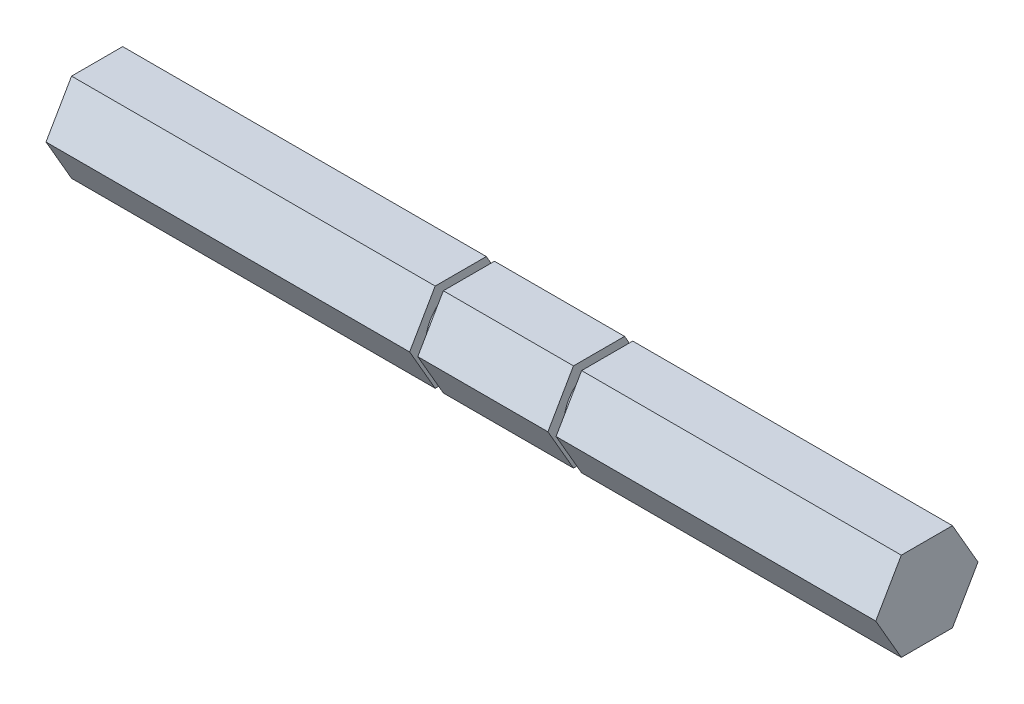
ISO-10303-21;
HEADER;
FILE_DESCRIPTION(('STEP AP214'),'2;1');
FILE_NAME('part.step','',(''),(''),'','','');
FILE_SCHEMA(('AUTOMOTIVE_DESIGN { 1 0 10303 214 1 1 1 1 }'));
ENDSEC;
DATA;
#1=APPLICATION_CONTEXT('core data for automotive mechanical design processes');
#2=APPLICATION_PROTOCOL_DEFINITION('international standard','automotive_design',2000,#1);
#3=PRODUCT_CONTEXT('',#1,'mechanical');
#4=PRODUCT('Part','Part','',(#3));
#5=PRODUCT_RELATED_PRODUCT_CATEGORY('part','',(#4));
#6=PRODUCT_DEFINITION_FORMATION('','',#4);
#7=PRODUCT_DEFINITION_CONTEXT('part definition',#1,'design');
#8=PRODUCT_DEFINITION('design','',#6,#7);
#9=PRODUCT_DEFINITION_SHAPE('','',#8);
#10=(LENGTH_UNIT() NAMED_UNIT(*) SI_UNIT(.MILLI.,.METRE.));
#11=(NAMED_UNIT(*) PLANE_ANGLE_UNIT() SI_UNIT($,.RADIAN.));
#12=(NAMED_UNIT(*) SI_UNIT($,.STERADIAN.) SOLID_ANGLE_UNIT());
#13=UNCERTAINTY_MEASURE_WITH_UNIT(LENGTH_MEASURE(1.E-05),#10,'distance_accuracy_value','');
#14=(GEOMETRIC_REPRESENTATION_CONTEXT(3) GLOBAL_UNCERTAINTY_ASSIGNED_CONTEXT((#13)) GLOBAL_UNIT_ASSIGNED_CONTEXT((#10,
#11,#12)) REPRESENTATION_CONTEXT('',''));
#15=CARTESIAN_POINT('',(0.,0.,0.));
#16=DIRECTION('',(0.,0.,1.));
#17=DIRECTION('',(1.,0.,0.));
#18=AXIS2_PLACEMENT_3D('',#15,#16,#17);
#19=CARTESIAN_POINT('',(59.5,-6.34999999999993,-3.66617420935418));
#20=DIRECTION('',(0.,0.499999999999995,0.866025403784442));
#21=DIRECTION('',(0.,-0.866025403784442,0.499999999999995));
#22=AXIS2_PLACEMENT_3D('',#19,#20,#21);
#23=PLANE('',#22);
#24=DIRECTION('',(0.,-0.866025403784442,0.499999999999995));
#25=VECTOR('',#24,1.);
#26=CARTESIAN_POINT('',(13.65,-6.34999999999993,-3.66617420935418));
#27=LINE('',#26,#25);
#28=CARTESIAN_POINT('',(13.65,0.,-7.33234841870822));
#29=VERTEX_POINT('',#28);
#30=CARTESIAN_POINT('',(13.65,-6.34999999999993,-3.66617420935418));
#31=VERTEX_POINT('',#30);
#32=EDGE_CURVE('E259',#29,#31,#27,.T.);
#33=ORIENTED_EDGE('',*,*,#32,.F.);
#34=DIRECTION('',(-1.,0.,0.));
#35=VECTOR('',#34,1.);
#36=CARTESIAN_POINT('',(59.5,0.,-7.33234841870822));
#37=LINE('',#36,#35);
#38=CARTESIAN_POINT('',(59.5,0.,-7.33234841870822));
#39=VERTEX_POINT('',#38);
#40=EDGE_CURVE('E164',#39,#29,#37,.T.);
#41=ORIENTED_EDGE('',*,*,#40,.F.);
#42=DIRECTION('',(0.,0.866025403784442,-0.499999999999995));
#43=VECTOR('',#42,1.);
#44=CARTESIAN_POINT('',(59.5,-6.34999999999993,-3.66617420935418));
#45=LINE('',#44,#43);
#46=CARTESIAN_POINT('',(59.5,-6.34999999999993,-3.66617420935418));
#47=VERTEX_POINT('',#46);
#48=EDGE_CURVE('E258',#47,#39,#45,.T.);
#49=ORIENTED_EDGE('',*,*,#48,.F.);
#50=DIRECTION('',(-1.,0.,0.));
#51=VECTOR('',#50,1.);
#52=CARTESIAN_POINT('',(59.5,-6.34999999999993,-3.66617420935418));
#53=LINE('',#52,#51);
#54=EDGE_CURVE('E183',#47,#31,#53,.T.);
#55=ORIENTED_EDGE('',*,*,#54,.T.);
#56=EDGE_LOOP('',(#33,#41,#49,#55));
#57=FACE_BOUND('',#56,.T.);
#58=ADVANCED_FACE('F34',(#57),#23,.F.);
#59=CARTESIAN_POINT('',(59.5,0.,-7.33234841870822));
#60=DIRECTION('',(0.,-0.500000000000001,0.866025403784438));
#61=DIRECTION('',(0.,-0.866025403784438,-0.500000000000001));
#62=AXIS2_PLACEMENT_3D('',#59,#60,#61);
#63=PLANE('',#62);
#64=DIRECTION('',(0.,-0.866025403784438,-0.500000000000001));
#65=VECTOR('',#64,1.);
#66=CARTESIAN_POINT('',(13.65,0.,-7.33234841870822));
#67=LINE('',#66,#65);
#68=CARTESIAN_POINT('',(13.65,6.34999999999999,-3.6661742093541));
#69=VERTEX_POINT('',#68);
#70=EDGE_CURVE('E255',#69,#29,#67,.T.);
#71=ORIENTED_EDGE('',*,*,#70,.F.);
#72=DIRECTION('',(-1.,0.,0.));
#73=VECTOR('',#72,1.);
#74=CARTESIAN_POINT('',(59.5,6.34999999999999,-3.6661742093541));
#75=LINE('',#74,#73);
#76=CARTESIAN_POINT('',(59.5,6.34999999999999,-3.6661742093541));
#77=VERTEX_POINT('',#76);
#78=EDGE_CURVE('E234',#77,#69,#75,.T.);
#79=ORIENTED_EDGE('',*,*,#78,.F.);
#80=DIRECTION('',(0.,0.866025403784438,0.500000000000001));
#81=VECTOR('',#80,1.);
#82=CARTESIAN_POINT('',(59.5,0.,-7.33234841870822));
#83=LINE('',#82,#81);
#84=EDGE_CURVE('E256',#39,#77,#83,.T.);
#85=ORIENTED_EDGE('',*,*,#84,.F.);
#86=ORIENTED_EDGE('',*,*,#40,.T.);
#87=EDGE_LOOP('',(#71,#79,#85,#86));
#88=FACE_BOUND('',#87,.T.);
#89=ADVANCED_FACE('F254',(#88),#63,.F.);
#90=CARTESIAN_POINT('',(59.5,6.34999999999999,-3.6661742093541));
#91=DIRECTION('',(0.,-1.,0.));
#92=DIRECTION('',(0.,0.,-1.));
#93=AXIS2_PLACEMENT_3D('',#90,#91,#92);
#94=PLANE('',#93);
#95=DIRECTION('',(0.,0.,-1.));
#96=VECTOR('',#95,1.);
#97=CARTESIAN_POINT('',(13.65,6.34999999999999,-3.6661742093541));
#98=LINE('',#97,#96);
#99=CARTESIAN_POINT('',(13.65,6.34999999999996,3.66617420935414));
#100=VERTEX_POINT('',#99);
#101=EDGE_CURVE('E264',#100,#69,#98,.T.);
#102=ORIENTED_EDGE('',*,*,#101,.F.);
#103=DIRECTION('',(-1.,0.,0.));
#104=VECTOR('',#103,1.);
#105=CARTESIAN_POINT('',(59.5,6.34999999999996,3.66617420935414));
#106=LINE('',#105,#104);
#107=CARTESIAN_POINT('',(59.5,6.34999999999996,3.66617420935414));
#108=VERTEX_POINT('',#107);
#109=EDGE_CURVE('E220',#108,#100,#106,.T.);
#110=ORIENTED_EDGE('',*,*,#109,.F.);
#111=DIRECTION('',(0.,0.,1.));
#112=VECTOR('',#111,1.);
#113=CARTESIAN_POINT('',(59.5,6.34999999999999,-3.6661742093541));
#114=LINE('',#113,#112);
#115=EDGE_CURVE('E278',#77,#108,#114,.T.);
#116=ORIENTED_EDGE('',*,*,#115,.F.);
#117=ORIENTED_EDGE('',*,*,#78,.T.);
#118=EDGE_LOOP('',(#102,#110,#116,#117));
#119=FACE_BOUND('',#118,.T.);
#120=ADVANCED_FACE('F317',(#119),#94,.F.);
#121=CARTESIAN_POINT('',(59.5,6.34999999999996,3.66617420935414));
#122=DIRECTION('',(0.,-0.499999999999995,-0.866025403784442));
#123=DIRECTION('',(0.,0.866025403784442,-0.499999999999995));
#124=AXIS2_PLACEMENT_3D('',#121,#122,#123);
#125=PLANE('',#124);
#126=DIRECTION('',(0.,0.866025403784442,-0.499999999999995));
#127=VECTOR('',#126,1.);
#128=CARTESIAN_POINT('',(13.65,6.34999999999996,3.66617420935414));
#129=LINE('',#128,#127);
#130=CARTESIAN_POINT('',(13.65,0.,7.33234841870822));
#131=VERTEX_POINT('',#130);
#132=EDGE_CURVE('E315',#131,#100,#129,.T.);
#133=ORIENTED_EDGE('',*,*,#132,.F.);
#134=DIRECTION('',(-1.,0.,0.));
#135=VECTOR('',#134,1.);
#136=CARTESIAN_POINT('',(59.5,0.,7.33234841870822));
#137=LINE('',#136,#135);
#138=CARTESIAN_POINT('',(59.5,0.,7.33234841870822));
#139=VERTEX_POINT('',#138);
#140=EDGE_CURVE('E207',#139,#131,#137,.T.);
#141=ORIENTED_EDGE('',*,*,#140,.F.);
#142=DIRECTION('',(0.,-0.866025403784441,0.499999999999995));
#143=VECTOR('',#142,1.);
#144=CARTESIAN_POINT('',(59.5,6.34999999999996,3.66617420935414));
#145=LINE('',#144,#143);
#146=EDGE_CURVE('E280',#108,#139,#145,.T.);
#147=ORIENTED_EDGE('',*,*,#146,.F.);
#148=ORIENTED_EDGE('',*,*,#109,.T.);
#149=EDGE_LOOP('',(#133,#141,#147,#148));
#150=FACE_BOUND('',#149,.T.);
#151=ADVANCED_FACE('F318',(#150),#125,.F.);
#152=CARTESIAN_POINT('',(59.5,0.,7.33234841870822));
#153=DIRECTION('',(0.,0.500000000000007,-0.866025403784435));
#154=DIRECTION('',(0.,0.866025403784435,0.500000000000007));
#155=AXIS2_PLACEMENT_3D('',#152,#153,#154);
#156=PLANE('',#155);
#157=DIRECTION('',(0.,0.866025403784435,0.500000000000007));
#158=VECTOR('',#157,1.);
#159=CARTESIAN_POINT('',(13.65,0.,7.33234841870822));
#160=LINE('',#159,#158);
#161=CARTESIAN_POINT('',(13.65,-6.35000000000001,3.66617420935405));
#162=VERTEX_POINT('',#161);
#163=EDGE_CURVE('E313',#162,#131,#160,.T.);
#164=ORIENTED_EDGE('',*,*,#163,.F.);
#165=DIRECTION('',(-1.,0.,0.));
#166=VECTOR('',#165,1.);
#167=CARTESIAN_POINT('',(59.5,-6.35000000000001,3.66617420935405));
#168=LINE('',#167,#166);
#169=CARTESIAN_POINT('',(59.5,-6.35000000000001,3.66617420935405));
#170=VERTEX_POINT('',#169);
#171=EDGE_CURVE('E196',#170,#162,#168,.T.);
#172=ORIENTED_EDGE('',*,*,#171,.F.);
#173=DIRECTION('',(0.,-0.866025403784435,-0.500000000000007));
#174=VECTOR('',#173,1.);
#175=CARTESIAN_POINT('',(59.5,0.,7.33234841870822));
#176=LINE('',#175,#174);
#177=EDGE_CURVE('E185',#139,#170,#176,.T.);
#178=ORIENTED_EDGE('',*,*,#177,.F.);
#179=ORIENTED_EDGE('',*,*,#140,.T.);
#180=EDGE_LOOP('',(#164,#172,#178,#179));
#181=FACE_BOUND('',#180,.T.);
#182=ADVANCED_FACE('F363',(#181),#156,.F.);
#183=CARTESIAN_POINT('',(59.5,-6.35000000000001,3.66617420935405));
#184=DIRECTION('',(0.,1.,0.));
#185=DIRECTION('',(0.,0.,1.));
#186=AXIS2_PLACEMENT_3D('',#183,#184,#185);
#187=PLANE('',#186);
#188=DIRECTION('',(0.,0.,1.));
#189=VECTOR('',#188,1.);
#190=CARTESIAN_POINT('',(13.65,-6.35000000000001,3.66617420935405));
#191=LINE('',#190,#189);
#192=EDGE_CURVE('E42',#31,#162,#191,.T.);
#193=ORIENTED_EDGE('',*,*,#192,.F.);
#194=ORIENTED_EDGE('',*,*,#54,.F.);
#195=DIRECTION('',(0.,0.,-1.));
#196=VECTOR('',#195,1.);
#197=CARTESIAN_POINT('',(59.5,-6.35000000000001,3.66617420935405));
#198=LINE('',#197,#196);
#199=EDGE_CURVE('E181',#170,#47,#198,.T.);
#200=ORIENTED_EDGE('',*,*,#199,.F.);
#201=ORIENTED_EDGE('',*,*,#171,.T.);
#202=EDGE_LOOP('',(#193,#194,#200,#201));
#203=FACE_BOUND('',#202,.T.);
#204=ADVANCED_FACE('F321',(#203),#187,.F.);
#205=CARTESIAN_POINT('',(59.5,0.,0.));
#206=DIRECTION('',(1.,0.,0.));
#207=DIRECTION('',(0.,0.,-1.));
#208=AXIS2_PLACEMENT_3D('',#205,#206,#207);
#209=PLANE('',#208);
#210=ORIENTED_EDGE('',*,*,#48,.T.);
#211=ORIENTED_EDGE('',*,*,#84,.T.);
#212=ORIENTED_EDGE('',*,*,#115,.T.);
#213=ORIENTED_EDGE('',*,*,#146,.T.);
#214=ORIENTED_EDGE('',*,*,#177,.T.);
#215=ORIENTED_EDGE('',*,*,#199,.T.);
#216=EDGE_LOOP('',(#210,#211,#212,#213,#214,#215));
#217=FACE_BOUND('',#216,.T.);
#218=ADVANCED_FACE('F320',(#217),#209,.T.);
#219=CARTESIAN_POINT('',(12.4816,13.9685232179915,0.));
#220=DIRECTION('',(1.,0.,0.));
#221=DIRECTION('',(0.,0.,-1.));
#222=AXIS2_PLACEMENT_3D('',#219,#220,#221);
#223=PLANE('',#222);
#224=CARTESIAN_POINT('',(12.4816,0.,0.));
#225=DIRECTION('',(-1.,0.,0.));
#226=DIRECTION('',(0.,0.,1.));
#227=AXIS2_PLACEMENT_3D('',#224,#225,#226);
#228=CIRCLE('',#227,5.0292);
#229=CARTESIAN_POINT('',(12.4816,0.,5.0292));
#230=VERTEX_POINT('',#229);
#231=EDGE_CURVE('E563',#230,#230,#228,.T.);
#232=ORIENTED_EDGE('',*,*,#231,.T.);
#233=EDGE_LOOP('',(#232));
#234=FACE_BOUND('',#233,.T.);
#235=DIRECTION('',(0.,0.866025403784442,-0.499999999999995));
#236=VECTOR('',#235,1.);
#237=CARTESIAN_POINT('',(12.4816,-6.34999999999993,-3.66617420935418));
#238=LINE('',#237,#236);
#239=CARTESIAN_POINT('',(12.4816,-6.34999999999993,-3.66617420935418));
#240=VERTEX_POINT('',#239);
#241=CARTESIAN_POINT('',(12.4816,0.,-7.33234841870822));
#242=VERTEX_POINT('',#241);
#243=EDGE_CURVE('E273',#240,#242,#238,.T.);
#244=ORIENTED_EDGE('',*,*,#243,.T.);
#245=DIRECTION('',(0.,0.866025403784438,0.500000000000001));
#246=VECTOR('',#245,1.);
#247=CARTESIAN_POINT('',(12.4816,0.,-7.33234841870822));
#248=LINE('',#247,#246);
#249=CARTESIAN_POINT('',(12.4816,6.34999999999999,-3.6661742093541));
#250=VERTEX_POINT('',#249);
#251=EDGE_CURVE('E271',#242,#250,#248,.T.);
#252=ORIENTED_EDGE('',*,*,#251,.T.);
#253=DIRECTION('',(0.,0.,1.));
#254=VECTOR('',#253,1.);
#255=CARTESIAN_POINT('',(12.4816,6.34999999999999,-3.6661742093541));
#256=LINE('',#255,#254);
#257=CARTESIAN_POINT('',(12.4816,6.34999999999996,3.66617420935414));
#258=VERTEX_POINT('',#257);
#259=EDGE_CURVE('E269',#250,#258,#256,.T.);
#260=ORIENTED_EDGE('',*,*,#259,.T.);
#261=DIRECTION('',(0.,-0.866025403784442,0.499999999999995));
#262=VECTOR('',#261,1.);
#263=CARTESIAN_POINT('',(12.4816,6.34999999999996,3.66617420935414));
#264=LINE('',#263,#262);
#265=CARTESIAN_POINT('',(12.4816,0.,7.33234841870822));
#266=VERTEX_POINT('',#265);
#267=EDGE_CURVE('E262',#258,#266,#264,.T.);
#268=ORIENTED_EDGE('',*,*,#267,.T.);
#269=DIRECTION('',(0.,-0.866025403784435,-0.500000000000007));
#270=VECTOR('',#269,1.);
#271=CARTESIAN_POINT('',(12.4816,0.,7.33234841870822));
#272=LINE('',#271,#270);
#273=CARTESIAN_POINT('',(12.4816,-6.35000000000001,3.66617420935405));
#274=VERTEX_POINT('',#273);
#275=EDGE_CURVE('E56',#266,#274,#272,.T.);
#276=ORIENTED_EDGE('',*,*,#275,.T.);
#277=DIRECTION('',(0.,0.,-1.));
#278=VECTOR('',#277,1.);
#279=CARTESIAN_POINT('',(12.4816,-6.35000000000001,3.66617420935405));
#280=LINE('',#279,#278);
#281=EDGE_CURVE('E11',#274,#240,#280,.T.);
#282=ORIENTED_EDGE('',*,*,#281,.T.);
#283=EDGE_LOOP('',(#244,#252,#260,#268,#276,#282));
#284=FACE_BOUND('',#283,.T.);
#285=ADVANCED_FACE('F337',(#234,#284),#223,.T.);
#286=CARTESIAN_POINT('',(13.65,13.9685232179915,0.));
#287=DIRECTION('',(-1.,0.,0.));
#288=DIRECTION('',(0.,0.,1.));
#289=AXIS2_PLACEMENT_3D('',#286,#287,#288);
#290=PLANE('',#289);
#291=CARTESIAN_POINT('',(13.65,0.,0.));
#292=DIRECTION('',(-1.,0.,0.));
#293=DIRECTION('',(0.,0.,1.));
#294=AXIS2_PLACEMENT_3D('',#291,#292,#293);
#295=CIRCLE('',#294,5.0292);
#296=CARTESIAN_POINT('',(13.65,0.,5.0292));
#297=VERTEX_POINT('',#296);
#298=EDGE_CURVE('E560',#297,#297,#295,.T.);
#299=ORIENTED_EDGE('',*,*,#298,.F.);
#300=EDGE_LOOP('',(#299));
#301=FACE_BOUND('',#300,.T.);
#302=ORIENTED_EDGE('',*,*,#32,.T.);
#303=ORIENTED_EDGE('',*,*,#192,.T.);
#304=ORIENTED_EDGE('',*,*,#163,.T.);
#305=ORIENTED_EDGE('',*,*,#132,.T.);
#306=ORIENTED_EDGE('',*,*,#101,.T.);
#307=ORIENTED_EDGE('',*,*,#70,.T.);
#308=EDGE_LOOP('',(#302,#303,#304,#305,#306,#307));
#309=FACE_BOUND('',#308,.T.);
#310=ADVANCED_FACE('F316',(#301,#309),#290,.T.);
#311=CARTESIAN_POINT('',(0.,0.,0.));
#312=DIRECTION('',(-1.,0.,0.));
#313=DIRECTION('',(0.,0.,1.));
#314=AXIS2_PLACEMENT_3D('',#311,#312,#313);
#315=CYLINDRICAL_SURFACE('',#314,5.0292);
#316=ORIENTED_EDGE('',*,*,#298,.T.);
#317=EDGE_LOOP('',(#316));
#318=FACE_BOUND('',#317,.T.);
#319=ORIENTED_EDGE('',*,*,#231,.F.);
#320=EDGE_LOOP('',(#319));
#321=FACE_BOUND('',#320,.T.);
#322=ADVANCED_FACE('F426',(#318,#321),#315,.T.);
#323=ORIENTED_EDGE('',*,*,#281,.F.);
#324=CARTESIAN_POINT('',(-6.18160000000001,-6.35000000000001,3.66617420935405));
#325=VERTEX_POINT('',#324);
#326=EDGE_CURVE('E195',#274,#325,#168,.T.);
#327=ORIENTED_EDGE('',*,*,#326,.T.);
#328=DIRECTION('',(0.,0.,1.));
#329=VECTOR('',#328,1.);
#330=CARTESIAN_POINT('',(-6.18160000000001,-6.35000000000001,3.66617420935405));
#331=LINE('',#330,#329);
#332=CARTESIAN_POINT('',(-6.18160000000001,-6.34999999999993,-3.66617420935418));
#333=VERTEX_POINT('',#332);
#334=EDGE_CURVE('E163',#333,#325,#331,.T.);
#335=ORIENTED_EDGE('',*,*,#334,.F.);
#336=EDGE_CURVE('E180',#240,#333,#53,.T.);
#337=ORIENTED_EDGE('',*,*,#336,.F.);
#338=EDGE_LOOP('',(#323,#327,#335,#337));
#339=FACE_BOUND('',#338,.T.);
#340=ADVANCED_FACE('F335',(#339),#187,.F.);
#341=ORIENTED_EDGE('',*,*,#275,.F.);
#342=CARTESIAN_POINT('',(-6.18160000000001,0.,7.33234841870822));
#343=VERTEX_POINT('',#342);
#344=EDGE_CURVE('E206',#266,#343,#137,.T.);
#345=ORIENTED_EDGE('',*,*,#344,.T.);
#346=DIRECTION('',(0.,0.866025403784435,0.500000000000007));
#347=VECTOR('',#346,1.);
#348=CARTESIAN_POINT('',(-6.18160000000001,0.,7.33234841870822));
#349=LINE('',#348,#347);
#350=EDGE_CURVE('E173',#325,#343,#349,.T.);
#351=ORIENTED_EDGE('',*,*,#350,.F.);
#352=ORIENTED_EDGE('',*,*,#326,.F.);
#353=EDGE_LOOP('',(#341,#345,#351,#352));
#354=FACE_BOUND('',#353,.T.);
#355=ADVANCED_FACE('F333',(#354),#156,.F.);
#356=ORIENTED_EDGE('',*,*,#267,.F.);
#357=CARTESIAN_POINT('',(-6.18160000000001,6.34999999999996,3.66617420935414));
#358=VERTEX_POINT('',#357);
#359=EDGE_CURVE('E219',#258,#358,#106,.T.);
#360=ORIENTED_EDGE('',*,*,#359,.T.);
#361=DIRECTION('',(0.,0.866025403784442,-0.499999999999995));
#362=VECTOR('',#361,1.);
#363=CARTESIAN_POINT('',(-6.18160000000001,6.34999999999996,3.66617420935414));
#364=LINE('',#363,#362);
#365=EDGE_CURVE('E305',#343,#358,#364,.T.);
#366=ORIENTED_EDGE('',*,*,#365,.F.);
#367=ORIENTED_EDGE('',*,*,#344,.F.);
#368=EDGE_LOOP('',(#356,#360,#366,#367));
#369=FACE_BOUND('',#368,.T.);
#370=ADVANCED_FACE('F352',(#369),#125,.F.);
#371=ORIENTED_EDGE('',*,*,#259,.F.);
#372=CARTESIAN_POINT('',(-6.18160000000001,6.34999999999999,-3.6661742093541));
#373=VERTEX_POINT('',#372);
#374=EDGE_CURVE('E233',#250,#373,#75,.T.);
#375=ORIENTED_EDGE('',*,*,#374,.T.);
#376=DIRECTION('',(0.,0.,-1.));
#377=VECTOR('',#376,1.);
#378=CARTESIAN_POINT('',(-6.18160000000001,6.34999999999999,-3.6661742093541));
#379=LINE('',#378,#377);
#380=EDGE_CURVE('E307',#358,#373,#379,.T.);
#381=ORIENTED_EDGE('',*,*,#380,.F.);
#382=ORIENTED_EDGE('',*,*,#359,.F.);
#383=EDGE_LOOP('',(#371,#375,#381,#382));
#384=FACE_BOUND('',#383,.T.);
#385=ADVANCED_FACE('F349',(#384),#94,.F.);
#386=ORIENTED_EDGE('',*,*,#251,.F.);
#387=CARTESIAN_POINT('',(-6.18160000000001,0.,-7.33234841870822));
#388=VERTEX_POINT('',#387);
#389=EDGE_CURVE('E246',#242,#388,#37,.T.);
#390=ORIENTED_EDGE('',*,*,#389,.T.);
#391=DIRECTION('',(0.,-0.866025403784438,-0.500000000000001));
#392=VECTOR('',#391,1.);
#393=CARTESIAN_POINT('',(-6.18160000000001,0.,-7.33234841870822));
#394=LINE('',#393,#392);
#395=EDGE_CURVE('E309',#373,#388,#394,.T.);
#396=ORIENTED_EDGE('',*,*,#395,.F.);
#397=ORIENTED_EDGE('',*,*,#374,.F.);
#398=EDGE_LOOP('',(#386,#390,#396,#397));
#399=FACE_BOUND('',#398,.T.);
#400=ADVANCED_FACE('F343',(#399),#63,.F.);
#401=ORIENTED_EDGE('',*,*,#243,.F.);
#402=ORIENTED_EDGE('',*,*,#336,.T.);
#403=DIRECTION('',(0.,-0.866025403784442,0.499999999999995));
#404=VECTOR('',#403,1.);
#405=CARTESIAN_POINT('',(-6.18160000000001,-6.34999999999993,-3.66617420935418));
#406=LINE('',#405,#404);
#407=EDGE_CURVE('E311',#388,#333,#406,.T.);
#408=ORIENTED_EDGE('',*,*,#407,.F.);
#409=ORIENTED_EDGE('',*,*,#389,.F.);
#410=EDGE_LOOP('',(#401,#402,#408,#409));
#411=FACE_BOUND('',#410,.T.);
#412=ADVANCED_FACE('F36',(#411),#23,.F.);
#413=CARTESIAN_POINT('',(-6.1816,13.9685232179914,0.));
#414=DIRECTION('',(-1.,0.,0.));
#415=DIRECTION('',(0.,0.,1.));
#416=AXIS2_PLACEMENT_3D('',#413,#414,#415);
#417=PLANE('',#416);
#418=CARTESIAN_POINT('',(-6.1816,0.,0.));
#419=DIRECTION('',(-1.,0.,0.));
#420=DIRECTION('',(0.,0.,1.));
#421=AXIS2_PLACEMENT_3D('',#418,#419,#420);
#422=CIRCLE('',#421,5.02919999999986);
#423=CARTESIAN_POINT('',(-6.1816,0.,5.02919999999986));
#424=VERTEX_POINT('',#423);
#425=EDGE_CURVE('E555',#424,#424,#422,.T.);
#426=ORIENTED_EDGE('',*,*,#425,.F.);
#427=EDGE_LOOP('',(#426));
#428=FACE_BOUND('',#427,.T.);
#429=ORIENTED_EDGE('',*,*,#407,.T.);
#430=ORIENTED_EDGE('',*,*,#334,.T.);
#431=ORIENTED_EDGE('',*,*,#350,.T.);
#432=ORIENTED_EDGE('',*,*,#365,.T.);
#433=ORIENTED_EDGE('',*,*,#380,.T.);
#434=ORIENTED_EDGE('',*,*,#395,.T.);
#435=EDGE_LOOP('',(#429,#430,#431,#432,#433,#434));
#436=FACE_BOUND('',#435,.T.);
#437=ADVANCED_FACE('F326',(#428,#436),#417,.T.);
#438=CARTESIAN_POINT('',(-7.35,13.9685232179914,0.));
#439=DIRECTION('',(1.,0.,0.));
#440=DIRECTION('',(0.,0.,-1.));
#441=AXIS2_PLACEMENT_3D('',#438,#439,#440);
#442=PLANE('',#441);
#443=CARTESIAN_POINT('',(-7.35,0.,0.));
#444=DIRECTION('',(-1.,0.,0.));
#445=DIRECTION('',(0.,0.,1.));
#446=AXIS2_PLACEMENT_3D('',#443,#444,#445);
#447=CIRCLE('',#446,5.02919999999986);
#448=CARTESIAN_POINT('',(-7.35,0.,5.02919999999986));
#449=VERTEX_POINT('',#448);
#450=EDGE_CURVE('E558',#449,#449,#447,.T.);
#451=ORIENTED_EDGE('',*,*,#450,.T.);
#452=EDGE_LOOP('',(#451));
#453=FACE_BOUND('',#452,.T.);
#454=DIRECTION('',(0.,0.866025403784442,-0.499999999999995));
#455=VECTOR('',#454,1.);
#456=CARTESIAN_POINT('',(-7.35000000000001,-6.34999999999993,-3.66617420935418));
#457=LINE('',#456,#455);
#458=CARTESIAN_POINT('',(-7.35000000000001,-6.34999999999993,-3.66617420935418));
#459=VERTEX_POINT('',#458);
#460=CARTESIAN_POINT('',(-7.35000000000001,0.,-7.33234841870822));
#461=VERTEX_POINT('',#460);
#462=EDGE_CURVE('E158',#459,#461,#457,.T.);
#463=ORIENTED_EDGE('',*,*,#462,.T.);
#464=DIRECTION('',(0.,0.866025403784438,0.500000000000001));
#465=VECTOR('',#464,1.);
#466=CARTESIAN_POINT('',(-7.35000000000001,0.,-7.33234841870822));
#467=LINE('',#466,#465);
#468=CARTESIAN_POINT('',(-7.35000000000001,6.34999999999999,-3.6661742093541));
#469=VERTEX_POINT('',#468);
#470=EDGE_CURVE('E174',#461,#469,#467,.T.);
#471=ORIENTED_EDGE('',*,*,#470,.T.);
#472=DIRECTION('',(0.,0.,1.));
#473=VECTOR('',#472,1.);
#474=CARTESIAN_POINT('',(-7.35000000000001,6.34999999999999,-3.6661742093541));
#475=LINE('',#474,#473);
#476=CARTESIAN_POINT('',(-7.35000000000001,6.34999999999996,3.66617420935414));
#477=VERTEX_POINT('',#476);
#478=EDGE_CURVE('E298',#469,#477,#475,.T.);
#479=ORIENTED_EDGE('',*,*,#478,.T.);
#480=DIRECTION('',(0.,-0.866025403784442,0.499999999999995));
#481=VECTOR('',#480,1.);
#482=CARTESIAN_POINT('',(-7.35000000000001,6.34999999999996,3.66617420935414));
#483=LINE('',#482,#481);
#484=CARTESIAN_POINT('',(-7.35000000000001,0.,7.33234841870822));
#485=VERTEX_POINT('',#484);
#486=EDGE_CURVE('E300',#477,#485,#483,.T.);
#487=ORIENTED_EDGE('',*,*,#486,.T.);
#488=DIRECTION('',(0.,-0.866025403784435,-0.500000000000007));
#489=VECTOR('',#488,1.);
#490=CARTESIAN_POINT('',(-7.35000000000001,0.,7.33234841870822));
#491=LINE('',#490,#489);
#492=CARTESIAN_POINT('',(-7.35000000000001,-6.35000000000001,3.66617420935405));
#493=VERTEX_POINT('',#492);
#494=EDGE_CURVE('E49',#485,#493,#491,.T.);
#495=ORIENTED_EDGE('',*,*,#494,.T.);
#496=DIRECTION('',(0.,0.,-1.));
#497=VECTOR('',#496,1.);
#498=CARTESIAN_POINT('',(-7.35000000000001,-6.35000000000001,3.66617420935405));
#499=LINE('',#498,#497);
#500=EDGE_CURVE('E155',#493,#459,#499,.T.);
#501=ORIENTED_EDGE('',*,*,#500,.T.);
#502=EDGE_LOOP('',(#463,#471,#479,#487,#495,#501));
#503=FACE_BOUND('',#502,.T.);
#504=ADVANCED_FACE('F157',(#453,#503),#442,.T.);
#505=CARTESIAN_POINT('',(0.,0.,0.));
#506=DIRECTION('',(-1.,0.,0.));
#507=DIRECTION('',(0.,0.,1.));
#508=AXIS2_PLACEMENT_3D('',#505,#506,#507);
#509=CYLINDRICAL_SURFACE('',#508,5.02919999999986);
#510=ORIENTED_EDGE('',*,*,#425,.T.);
#511=EDGE_LOOP('',(#510));
#512=FACE_BOUND('',#511,.T.);
#513=ORIENTED_EDGE('',*,*,#450,.F.);
#514=EDGE_LOOP('',(#513));
#515=FACE_BOUND('',#514,.T.);
#516=ADVANCED_FACE('F483',(#512,#515),#509,.T.);
#517=CARTESIAN_POINT('',(-59.5,0.,0.));
#518=DIRECTION('',(1.,0.,0.));
#519=DIRECTION('',(0.,0.,-1.));
#520=AXIS2_PLACEMENT_3D('',#517,#518,#519);
#521=PLANE('',#520);
#522=DIRECTION('',(0.,0.866025403784442,-0.499999999999995));
#523=VECTOR('',#522,1.);
#524=CARTESIAN_POINT('',(-59.5,-6.34999999999993,-3.66617420935418));
#525=LINE('',#524,#523);
#526=CARTESIAN_POINT('',(-59.5,-6.34999999999993,-3.66617420935418));
#527=VERTEX_POINT('',#526);
#528=CARTESIAN_POINT('',(-59.5,0.,-7.33234841870822));
#529=VERTEX_POINT('',#528);
#530=EDGE_CURVE('E275',#527,#529,#525,.T.);
#531=ORIENTED_EDGE('',*,*,#530,.F.);
#532=DIRECTION('',(0.,0.,-1.));
#533=VECTOR('',#532,1.);
#534=CARTESIAN_POINT('',(-59.5,-6.35000000000001,3.66617420935405));
#535=LINE('',#534,#533);
#536=CARTESIAN_POINT('',(-59.5,-6.35000000000001,3.66617420935405));
#537=VERTEX_POINT('',#536);
#538=EDGE_CURVE('E178',#537,#527,#535,.T.);
#539=ORIENTED_EDGE('',*,*,#538,.F.);
#540=DIRECTION('',(0.,-0.866025403784435,-0.500000000000007));
#541=VECTOR('',#540,1.);
#542=CARTESIAN_POINT('',(-59.5,0.,7.33234841870822));
#543=LINE('',#542,#541);
#544=CARTESIAN_POINT('',(-59.5,0.,7.33234841870822));
#545=VERTEX_POINT('',#544);
#546=EDGE_CURVE('E290',#545,#537,#543,.T.);
#547=ORIENTED_EDGE('',*,*,#546,.F.);
#548=DIRECTION('',(0.,-0.866025403784441,0.499999999999995));
#549=VECTOR('',#548,1.);
#550=CARTESIAN_POINT('',(-59.5,6.34999999999996,3.66617420935414));
#551=LINE('',#550,#549);
#552=CARTESIAN_POINT('',(-59.5,6.34999999999996,3.66617420935414));
#553=VERTEX_POINT('',#552);
#554=EDGE_CURVE('E288',#553,#545,#551,.T.);
#555=ORIENTED_EDGE('',*,*,#554,.F.);
#556=DIRECTION('',(0.,0.,1.));
#557=VECTOR('',#556,1.);
#558=CARTESIAN_POINT('',(-59.5,6.34999999999999,-3.6661742093541));
#559=LINE('',#558,#557);
#560=CARTESIAN_POINT('',(-59.5,6.34999999999999,-3.6661742093541));
#561=VERTEX_POINT('',#560);
#562=EDGE_CURVE('E286',#561,#553,#559,.T.);
#563=ORIENTED_EDGE('',*,*,#562,.F.);
#564=DIRECTION('',(0.,0.866025403784438,0.500000000000001));
#565=VECTOR('',#564,1.);
#566=CARTESIAN_POINT('',(-59.5,0.,-7.33234841870822));
#567=LINE('',#566,#565);
#568=EDGE_CURVE('E284',#529,#561,#567,.T.);
#569=ORIENTED_EDGE('',*,*,#568,.F.);
#570=EDGE_LOOP('',(#531,#539,#547,#555,#563,#569));
#571=FACE_BOUND('',#570,.T.);
#572=ADVANCED_FACE('F295',(#571),#521,.F.);
#573=ORIENTED_EDGE('',*,*,#500,.F.);
#574=EDGE_CURVE('E190',#493,#537,#168,.T.);
#575=ORIENTED_EDGE('',*,*,#574,.T.);
#576=ORIENTED_EDGE('',*,*,#538,.T.);
#577=EDGE_CURVE('E170',#459,#527,#53,.T.);
#578=ORIENTED_EDGE('',*,*,#577,.F.);
#579=EDGE_LOOP('',(#573,#575,#576,#578));
#580=FACE_BOUND('',#579,.T.);
#581=ADVANCED_FACE('F176',(#580),#187,.F.);
#582=ORIENTED_EDGE('',*,*,#494,.F.);
#583=EDGE_CURVE('E201',#485,#545,#137,.T.);
#584=ORIENTED_EDGE('',*,*,#583,.T.);
#585=ORIENTED_EDGE('',*,*,#546,.T.);
#586=ORIENTED_EDGE('',*,*,#574,.F.);
#587=EDGE_LOOP('',(#582,#584,#585,#586));
#588=FACE_BOUND('',#587,.T.);
#589=ADVANCED_FACE('F292',(#588),#156,.F.);
#590=ORIENTED_EDGE('',*,*,#486,.F.);
#591=EDGE_CURVE('E214',#477,#553,#106,.T.);
#592=ORIENTED_EDGE('',*,*,#591,.T.);
#593=ORIENTED_EDGE('',*,*,#554,.T.);
#594=ORIENTED_EDGE('',*,*,#583,.F.);
#595=EDGE_LOOP('',(#590,#592,#593,#594));
#596=FACE_BOUND('',#595,.T.);
#597=ADVANCED_FACE('F355',(#596),#125,.F.);
#598=ORIENTED_EDGE('',*,*,#478,.F.);
#599=EDGE_CURVE('E228',#469,#561,#75,.T.);
#600=ORIENTED_EDGE('',*,*,#599,.T.);
#601=ORIENTED_EDGE('',*,*,#562,.T.);
#602=ORIENTED_EDGE('',*,*,#591,.F.);
#603=EDGE_LOOP('',(#598,#600,#601,#602));
#604=FACE_BOUND('',#603,.T.);
#605=ADVANCED_FACE('F361',(#604),#94,.F.);
#606=ORIENTED_EDGE('',*,*,#470,.F.);
#607=EDGE_CURVE('E172',#461,#529,#37,.T.);
#608=ORIENTED_EDGE('',*,*,#607,.T.);
#609=ORIENTED_EDGE('',*,*,#568,.T.);
#610=ORIENTED_EDGE('',*,*,#599,.F.);
#611=EDGE_LOOP('',(#606,#608,#609,#610));
#612=FACE_BOUND('',#611,.T.);
#613=ADVANCED_FACE('F297',(#612),#63,.F.);
#614=ORIENTED_EDGE('',*,*,#462,.F.);
#615=ORIENTED_EDGE('',*,*,#577,.T.);
#616=ORIENTED_EDGE('',*,*,#530,.T.);
#617=ORIENTED_EDGE('',*,*,#607,.F.);
#618=EDGE_LOOP('',(#614,#615,#616,#617));
#619=FACE_BOUND('',#618,.T.);
#620=ADVANCED_FACE('F168',(#619),#23,.F.);
#621=CLOSED_SHELL('',(#58,#89,#120,#151,#182,#204,#218,#285,#310,#322,#340,#355,#370,#385,#400,
#412,#437,#504,#516,#572,#581,#589,#597,#605,#613,#620));
#622=MANIFOLD_SOLID_BREP('B2',#621);
#623=ADVANCED_BREP_SHAPE_REPRESENTATION('',(#18,#622),#14);
#624=SHAPE_DEFINITION_REPRESENTATION(#9,#623);
ENDSEC;
END-ISO-10303-21;
